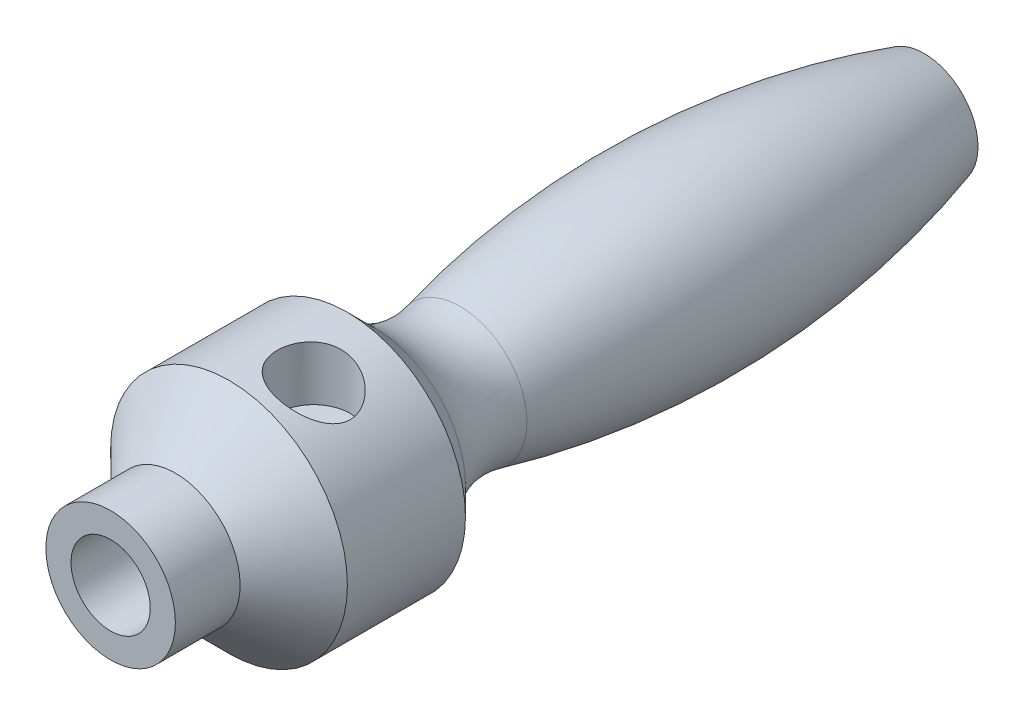
ISO-10303-21;
HEADER;
FILE_DESCRIPTION(('STEP AP214'),'2;1');
FILE_NAME('part.step','',(''),(''),'','','');
FILE_SCHEMA(('AUTOMOTIVE_DESIGN { 1 0 10303 214 1 1 1 1 }'));
ENDSEC;
DATA;
#1=APPLICATION_CONTEXT('core data for automotive mechanical design processes');
#2=APPLICATION_PROTOCOL_DEFINITION('international standard','automotive_design',2000,#1);
#3=PRODUCT_CONTEXT('',#1,'mechanical');
#4=PRODUCT('Part','Part','',(#3));
#5=PRODUCT_RELATED_PRODUCT_CATEGORY('part','',(#4));
#6=PRODUCT_DEFINITION_FORMATION('','',#4);
#7=PRODUCT_DEFINITION_CONTEXT('part definition',#1,'design');
#8=PRODUCT_DEFINITION('design','',#6,#7);
#9=PRODUCT_DEFINITION_SHAPE('','',#8);
#10=(LENGTH_UNIT() NAMED_UNIT(*) SI_UNIT(.MILLI.,.METRE.));
#11=(NAMED_UNIT(*) PLANE_ANGLE_UNIT() SI_UNIT($,.RADIAN.));
#12=(NAMED_UNIT(*) SI_UNIT($,.STERADIAN.) SOLID_ANGLE_UNIT());
#13=UNCERTAINTY_MEASURE_WITH_UNIT(LENGTH_MEASURE(1.E-05),#10,'distance_accuracy_value','');
#14=(GEOMETRIC_REPRESENTATION_CONTEXT(3) GLOBAL_UNCERTAINTY_ASSIGNED_CONTEXT((#13)) GLOBAL_UNIT_ASSIGNED_CONTEXT((#10,
#11,#12)) REPRESENTATION_CONTEXT('',''));
#15=CARTESIAN_POINT('',(0.,0.,0.));
#16=DIRECTION('',(0.,0.,1.));
#17=DIRECTION('',(1.,0.,0.));
#18=AXIS2_PLACEMENT_3D('',#15,#16,#17);
#19=CARTESIAN_POINT('',(0.,0.,0.));
#20=DIRECTION('',(0.,0.,1.));
#21=DIRECTION('',(1.,0.,0.));
#22=AXIS2_PLACEMENT_3D('',#19,#20,#21);
#23=CYLINDRICAL_SURFACE('',#22,13.);
#24=CARTESIAN_POINT('',(0.,0.,-13.));
#25=DIRECTION('',(0.,0.,1.));
#26=DIRECTION('',(1.,0.,0.));
#27=AXIS2_PLACEMENT_3D('',#24,#25,#26);
#28=CIRCLE('',#27,13.);
#29=CARTESIAN_POINT('',(13.,0.,-13.));
#30=VERTEX_POINT('',#29);
#31=EDGE_CURVE('E142',#30,#30,#28,.T.);
#32=ORIENTED_EDGE('',*,*,#31,.F.);
#33=EDGE_LOOP('',(#32));
#34=FACE_BOUND('',#33,.T.);
#35=CARTESIAN_POINT('',(0.,0.,-25.9661538461538));
#36=DIRECTION('',(0.,0.,1.));
#37=DIRECTION('',(1.,0.,0.));
#38=AXIS2_PLACEMENT_3D('',#35,#36,#37);
#39=CIRCLE('',#38,13.);
#40=CARTESIAN_POINT('',(13.,0.,-25.9661538461538));
#41=VERTEX_POINT('',#40);
#42=EDGE_CURVE('E139',#41,#41,#39,.T.);
#43=ORIENTED_EDGE('',*,*,#42,.T.);
#44=EDGE_LOOP('',(#43));
#45=FACE_BOUND('',#44,.T.);
#46=CARTESIAN_POINT('',(3.8,12.432216214336,-22.5));
#47=CARTESIAN_POINT('',(4.03866888973674,12.3592640434929,-22.5000008312517));
#48=CARTESIAN_POINT('',(4.27518952197054,12.2793821450752,-22.4785851030644));
#49=CARTESIAN_POINT('',(4.73696804686455,12.1087505432336,-22.3957917651093));
#50=CARTESIAN_POINT('',(4.96222245494336,12.017997506533,-22.3344018728542));
#51=CARTESIAN_POINT('',(5.39536516527308,11.8298614989242,-22.175305913249));
#52=CARTESIAN_POINT('',(5.60331327784174,11.7325036698764,-22.0777318739504));
#53=CARTESIAN_POINT('',(5.99882847099248,11.5352918197062,-21.8492343794999));
#54=CARTESIAN_POINT('',(6.1863827534139,11.4354362789347,-21.7182901532285));
#55=CARTESIAN_POINT('',(6.54902174922886,11.2319333452747,-21.4158643306936));
#56=CARTESIAN_POINT('',(6.72246196987392,11.1284718003313,-21.2422748446885));
#57=CARTESIAN_POINT('',(7.03698495324367,10.9322992744837,-20.8627436463934));
#58=CARTESIAN_POINT('',(7.17810268279124,10.8395767302274,-20.6568373052602));
#59=CARTESIAN_POINT('',(7.39330377428691,10.6935431512084,-20.267832683763));
#60=CARTESIAN_POINT('',(7.47534684926271,10.6360902422664,-20.0907319377081));
#61=CARTESIAN_POINT('',(7.57905805934738,10.5621812161158,-19.8146879260425));
#62=CARTESIAN_POINT('',(7.61040370697754,10.5395893140938,-19.7209374016599));
#63=CARTESIAN_POINT('',(7.66626148001394,10.4990299553628,-19.5304647431467));
#64=CARTESIAN_POINT('',(7.6907765415114,10.4810605119702,-19.4337439056999));
#65=CARTESIAN_POINT('',(7.73276428217518,10.4501216935964,-19.2372466750263));
#66=CARTESIAN_POINT('',(7.75018483091966,10.4371893604429,-19.1374532611335));
#67=CARTESIAN_POINT('',(7.77742666433512,10.4169057112706,-18.9363139318434));
#68=CARTESIAN_POINT('',(7.78725148563133,10.4095517979297,-18.8349687613983));
#69=CARTESIAN_POINT('',(7.79913294968772,10.4006529159679,-18.6315756109666));
#70=CARTESIAN_POINT('',(7.80119019108627,10.399107499693,-18.5295276857478));
#71=CARTESIAN_POINT('',(7.79749902893922,10.4018755209126,-18.3256594642715));
#72=CARTESIAN_POINT('',(7.79175122382043,10.406188509233,-18.2238391511621));
#73=CARTESIAN_POINT('',(7.77358311988037,10.4197657071794,-18.0321404879848));
#74=CARTESIAN_POINT('',(7.7619395283524,10.428453028454,-17.942146294432));
#75=CARTESIAN_POINT('',(7.7326818383696,10.4501654292255,-17.7636537658123));
#76=CARTESIAN_POINT('',(7.71506575957209,10.4631919474775,-17.675155937138));
#77=CARTESIAN_POINT('',(7.65358779850002,10.5083405740202,-17.412773246216));
#78=CARTESIAN_POINT('',(7.60108317498158,10.5465418331196,-17.24186629351));
#79=CARTESIAN_POINT('',(7.47223549221576,10.6382421721251,-16.9033843198777));
#80=CARTESIAN_POINT('',(7.39482899152693,10.6924123571373,-16.7364062237667));
#81=CARTESIAN_POINT('',(7.21993657266396,10.8112763381226,-16.4174185206025));
#82=CARTESIAN_POINT('',(7.12244145752811,10.8759749513544,-16.2654158168594));
#83=CARTESIAN_POINT('',(6.89086218168677,11.0244316207567,-15.9522680769638));
#84=CARTESIAN_POINT('',(6.75335502947749,11.1095340366995,-15.7942925272974));
#85=CARTESIAN_POINT('',(6.45699542143629,11.2843633695973,-15.5027286128934));
#86=CARTESIAN_POINT('',(6.29812665724968,11.3740937871798,-15.3691590663406));
#87=CARTESIAN_POINT('',(5.93642161641261,11.5674982067501,-15.1099562605133));
#88=CARTESIAN_POINT('',(5.73056783174414,11.6712343226745,-14.9885574395085));
#89=CARTESIAN_POINT('',(5.29829703971847,11.8737044028926,-14.7835185392754));
#90=CARTESIAN_POINT('',(5.07187560512112,11.9724372830676,-14.6998866127135));
#91=CARTESIAN_POINT('',(4.71963841447271,12.113687969068,-14.6052153672505));
#92=CARTESIAN_POINT('',(4.59928052752428,12.1599145044003,-14.5787165603922));
#93=CARTESIAN_POINT('',(4.35555398261508,12.249324298558,-14.5368415780157));
#94=CARTESIAN_POINT('',(4.23218668818855,12.2925089023981,-14.5214604585042));
#95=CARTESIAN_POINT('',(3.98343347089435,12.3753565382,-14.5022614734818));
#96=CARTESIAN_POINT('',(3.85804825040597,12.4150207654677,-14.4984396684384));
#97=CARTESIAN_POINT('',(3.60631432012454,12.49046640941,-14.5027102586209));
#98=CARTESIAN_POINT('',(3.47996571961999,12.5262482596996,-14.5108013218487));
#99=CARTESIAN_POINT('',(3.23885317960885,12.5906306898785,-14.5378686612623));
#100=CARTESIAN_POINT('',(3.12406665000116,12.6195875217306,-14.5558034972374));
#101=CARTESIAN_POINT('',(2.89569346143271,12.6739390849278,-14.6018217415477));
#102=CARTESIAN_POINT('',(2.78210669431827,12.6993341399308,-14.6299042269376));
#103=CARTESIAN_POINT('',(2.55719333927117,12.7465275115943,-14.6961635559671));
#104=CARTESIAN_POINT('',(2.44586600535568,12.7683270328855,-14.7343370075748));
#105=CARTESIAN_POINT('',(2.22647270072708,12.8084055773594,-14.8206109880181));
#106=CARTESIAN_POINT('',(2.11840657790586,12.8266847649508,-14.8687110530378));
#107=CARTESIAN_POINT('',(1.91440232498268,12.8586517982827,-14.9706169112978));
#108=CARTESIAN_POINT('',(1.81815846273046,12.872579291469,-15.0237371868162));
#109=CARTESIAN_POINT('',(1.63008771088667,12.8977446942279,-15.1379194344255));
#110=CARTESIAN_POINT('',(1.53826226838369,12.9089817273673,-15.19898398444));
#111=CARTESIAN_POINT('',(1.35983691534852,12.9289946090808,-15.3286031180182));
#112=CARTESIAN_POINT('',(1.27323478763305,12.9377715077815,-15.3971544883593));
#113=CARTESIAN_POINT('',(1.10585930243799,12.9531518305977,-15.5413158793725));
#114=CARTESIAN_POINT('',(1.02508813184976,12.959754442523,-15.6169285242294));
#115=CARTESIAN_POINT('',(0.870861179696782,12.9710260482357,-15.773810624714));
#116=CARTESIAN_POINT('',(0.797335777290691,12.9757151664774,-15.855010120484));
#117=CARTESIAN_POINT('',(0.65714561854057,12.9835699521421,-16.0232127367165));
#118=CARTESIAN_POINT('',(0.590483355684938,12.9867350673952,-16.1102179476993));
#119=CARTESIAN_POINT('',(0.401583105720889,12.9944081250472,-16.3790081684645));
#120=CARTESIAN_POINT('',(0.290280862639021,12.9971034566512,-16.5687213626638));
#121=CARTESIAN_POINT('',(0.098640586649652,12.9999876317857,-16.9671246762101));
#122=CARTESIAN_POINT('',(0.0188679428599122,13.0001325755197,-17.1760850299163));
#123=CARTESIAN_POINT('',(-0.10481144427014,12.9997253813955,-17.6043941904658));
#124=CARTESIAN_POINT('',(-0.14871677862761,12.9991732161548,-17.8237434050588));
#125=CARTESIAN_POINT('',(-0.199624314887042,12.9984931963582,-18.268579573878));
#126=CARTESIAN_POINT('',(-0.206308869678826,12.9983689975331,-18.4941029018869));
#127=CARTESIAN_POINT('',(-0.181736810220484,12.998735084221,-18.9430769418921));
#128=CARTESIAN_POINT('',(-0.150479308090461,12.9992253841137,-19.1665276052627));
#129=CARTESIAN_POINT('',(-0.0508902433648136,12.999994802002,-19.6050911822196));
#130=CARTESIAN_POINT('',(0.0174541758231861,13.0002738466833,-19.8202011766966));
#131=CARTESIAN_POINT('',(0.18928912592395,12.9989041644428,-20.2359001622078));
#132=CARTESIAN_POINT('',(0.292780638485772,12.9972553836743,-20.4364887474729));
#133=CARTESIAN_POINT('',(0.531803205629528,12.9896655886868,-20.8171844872617));
#134=CARTESIAN_POINT('',(0.667298429711154,12.9837293593956,-20.9973142153891));
#135=CARTESIAN_POINT('',(0.966353497765473,12.9648964513341,-21.3321032651323));
#136=CARTESIAN_POINT('',(1.12990923494068,12.9520007905199,-21.4867663074435));
#137=CARTESIAN_POINT('',(1.47778305563094,12.9168984429496,-21.764383334371));
#138=CARTESIAN_POINT('',(1.66181474484716,12.8948106663993,-21.8877109821617));
#139=CARTESIAN_POINT('',(2.04636003378755,12.8393969151784,-22.1018309518189));
#140=CARTESIAN_POINT('',(2.2468733611252,12.8060711262064,-22.1926238112442));
#141=CARTESIAN_POINT('',(2.6709027267283,12.7246092532685,-22.3443425409857));
#142=CARTESIAN_POINT('',(2.89507167378101,12.6756704321089,-22.403018802019));
#143=CARTESIAN_POINT('',(3.34679944205318,12.5639619946616,-22.4808562609491));
#144=CARTESIAN_POINT('',(3.57435977963556,12.5011860072708,-22.4999992141254));
#145=CARTESIAN_POINT('',(3.8,12.432216214336,-22.5));
#146=B_SPLINE_CURVE_WITH_KNOTS('',3,(#46,#47,#48,#49,#50,#51,#52,#53,#54,#55,#56,#57,#58,#59,
#60,#61,#62,#63,#64,#65,#66,#67,#68,#69,#70,#71,#72,#73,#74,#75,#76,#77,#78,#79,#80,#81,#82,#83,
#84,#85,#86,#87,#88,#89,#90,#91,#92,#93,#94,#95,#96,#97,#98,#99,#100,#101,#102,#103,#104,#105,
#106,#107,#108,#109,#110,#111,#112,#113,#114,#115,#116,#117,#118,#119,#120,#121,#122,#123,#124,
#125,#126,#127,#128,#129,#130,#131,#132,#133,#134,#135,#136,#137,#138,#139,#140,#141,#142,#143,
#144,#145),.UNSPECIFIED.,.T.,.F.,(4,2,2,2,2,2,2,2,2,2,2,2,2,2,2,2,2,2,2,2,2,2,2,2,2,2,2,2,2,2,2,
2,2,2,2,2,2,2,2,2,2,2,2,2,2,2,2,2,2,4),(0.,0.747763835208472,1.49575753729901,2.24104840562656,
2.9868043147551,3.7818705015663,4.57607247137836,5.18378468039269,5.48766354302585,
5.79141158271915,6.09735294980327,6.40315178245782,6.70892704706973,7.01467886867109,
7.28783352245077,7.56107883690454,8.10717254486274,8.6806526817086,9.25439595471119,
9.93001980920547,10.6061624234673,11.3842699965005,12.1625454579079,12.5569727532558,
12.951224540188,13.3453419469332,13.7394152900842,14.0981423247377,14.4568367407922,
14.8154107363504,15.1739679815132,15.5059948458296,15.8381297231441,16.1701226095695,
16.5022393694056,16.8307671343485,17.1594138405717,17.8160687759269,18.4840158556322,
19.1519891731775,19.8256544273383,20.4993354462051,21.173250153423,21.8471836844492,
22.520366244306,23.1934503644186,23.8580854812259,24.5227096160383,25.2293278214775,
25.9362720601804),.UNSPECIFIED.);
#147=CARTESIAN_POINT('',(3.8,12.432216214336,-22.5));
#148=VERTEX_POINT('',#147);
#149=EDGE_CURVE('E38',#148,#148,#146,.T.);
#150=ORIENTED_EDGE('',*,*,#149,.T.);
#151=EDGE_LOOP('',(#150));
#152=FACE_BOUND('',#151,.T.);
#153=ADVANCED_FACE('F33',(#34,#45,#152),#23,.T.);
#154=CARTESIAN_POINT('',(3.8,-5.,-18.5));
#155=DIRECTION('',(0.,1.,0.));
#156=DIRECTION('',(0.,0.,1.));
#157=AXIS2_PLACEMENT_3D('',#154,#155,#156);
#158=CYLINDRICAL_SURFACE('',#157,1.5);
#159=CARTESIAN_POINT('',(3.8,-5.,-18.5));
#160=DIRECTION('',(0.,1.,0.));
#161=DIRECTION('',(0.,0.,1.));
#162=AXIS2_PLACEMENT_3D('',#159,#160,#161);
#163=CIRCLE('',#162,1.5);
#164=CARTESIAN_POINT('',(3.8,-5.,-17.));
#165=VERTEX_POINT('',#164);
#166=EDGE_CURVE('E60',#165,#165,#163,.T.);
#167=ORIENTED_EDGE('',*,*,#166,.F.);
#168=EDGE_LOOP('',(#167));
#169=FACE_BOUND('',#168,.T.);
#170=CARTESIAN_POINT('',(4.35,0.,-19.8955285736953));
#171=CARTESIAN_POINT('',(4.34999973253327,-0.115602395936597,-19.8955296980727));
#172=CARTESIAN_POINT('',(4.3453873950031,-0.2312090392118,-19.8973732661898));
#173=CARTESIAN_POINT('',(4.32698413936694,-0.461591055147139,-19.9044153235058));
#174=CARTESIAN_POINT('',(4.3131921294526,-0.576366327284283,-19.9096142117762));
#175=CARTESIAN_POINT('',(4.27648218663029,-0.804754721607832,-19.9224424154697));
#176=CARTESIAN_POINT('',(4.25352949667548,-0.918361707531673,-19.930080965042));
#177=CARTESIAN_POINT('',(4.19866022913715,-1.14330966269523,-19.946335672407));
#178=CARTESIAN_POINT('',(4.16674382712765,-1.25465067627319,-19.9549518110495));
#179=CARTESIAN_POINT('',(4.09288819660683,-1.4782038822241,-19.9716310406221));
#180=CARTESIAN_POINT('',(4.05064726500249,-1.59031883186863,-19.979665682508));
#181=CARTESIAN_POINT('',(3.95695324199912,-1.81090655310153,-19.992515642876));
#182=CARTESIAN_POINT('',(3.90549608311082,-1.91937769132629,-19.9973295354524));
#183=CARTESIAN_POINT('',(3.79401667896578,-2.13124000149958,-20.0010195569177));
#184=CARTESIAN_POINT('',(3.7340417822911,-2.23465526913691,-19.9999273489804));
#185=CARTESIAN_POINT('',(3.6060556449965,-2.43578045539861,-19.9887932238877));
#186=CARTESIAN_POINT('',(3.53805629545628,-2.53349850324665,-19.9787644085345));
#187=CARTESIAN_POINT('',(3.40165163401747,-2.71345903232513,-19.947676548973));
#188=CARTESIAN_POINT('',(3.33381507428981,-2.7963057143697,-19.9276724716946));
#189=CARTESIAN_POINT('',(3.19451132066189,-2.95442941658624,-19.8743831496933));
#190=CARTESIAN_POINT('',(3.1230469874953,-3.0297122659308,-19.8411082321533));
#191=CARTESIAN_POINT('',(2.99033748263496,-3.16033964687315,-19.7646783435335));
#192=CARTESIAN_POINT('',(2.92913741238037,-3.21698769986797,-19.7237003193369));
#193=CARTESIAN_POINT('',(2.80948237786733,-3.3219910383414,-19.6290138065664));
#194=CARTESIAN_POINT('',(2.75102454117531,-3.37035514859924,-19.575319012191));
#195=CARTESIAN_POINT('',(2.6488769793886,-3.45102072938017,-19.464219668866));
#196=CARTESIAN_POINT('',(2.60429076584765,-3.48464520755532,-19.4086037101785));
#197=CARTESIAN_POINT('',(2.52212139374479,-3.54457227278741,-19.2888541539648));
#198=CARTESIAN_POINT('',(2.48453672951206,-3.57087643466779,-19.2247223928396));
#199=CARTESIAN_POINT('',(2.41847548636282,-3.61594979940475,-19.0891485909684));
#200=CARTESIAN_POINT('',(2.39003272188596,-3.63469109222847,-19.0176806716335));
#201=CARTESIAN_POINT('',(2.34422302265472,-3.66440628641626,-18.8697368531602));
#202=CARTESIAN_POINT('',(2.32685474633411,-3.67538112862778,-18.7932615618544));
#203=CARTESIAN_POINT('',(2.30507397495752,-3.68907658629589,-18.6432957509376));
#204=CARTESIAN_POINT('',(2.29983955306296,-3.69232130177534,-18.569971119213));
#205=CARTESIAN_POINT('',(2.30016784590081,-3.69211719662813,-18.4233658956445));
#206=CARTESIAN_POINT('',(2.30572792802919,-3.68867000804809,-18.3500852974215));
#207=CARTESIAN_POINT('',(2.32709547759172,-3.67522485712081,-18.2073476418621));
#208=CARTESIAN_POINT('',(2.34267194562136,-3.66537451097042,-18.137841776258));
#209=CARTESIAN_POINT('',(2.38303311249966,-3.63926180583502,-18.0028395476461));
#210=CARTESIAN_POINT('',(2.40781737604219,-3.62299974996665,-17.9373429952651));
#211=CARTESIAN_POINT('',(2.46582567881114,-3.58377508313715,-17.8108665623104));
#212=CARTESIAN_POINT('',(2.49919138853675,-3.56069892567822,-17.7499871924614));
#213=CARTESIAN_POINT('',(2.57241221315142,-3.50816498045908,-17.6353265668377));
#214=CARTESIAN_POINT('',(2.61226839391201,-3.47870614426606,-17.581546479545));
#215=CARTESIAN_POINT('',(2.69942960498699,-3.4115678562927,-17.4784293975414));
#216=CARTESIAN_POINT('',(2.74705657238663,-3.37346622111783,-17.429641538824));
#217=CARTESIAN_POINT('',(2.84526708942468,-3.29106047465249,-17.3411801972641));
#218=CARTESIAN_POINT('',(2.89585216949143,-3.24675313590316,-17.3015114856405));
#219=CARTESIAN_POINT('',(3.02119226277005,-3.13129826185969,-17.2148514049952));
#220=CARTESIAN_POINT('',(3.09649430364601,-3.05709756116088,-17.1727115464906));
#221=CARTESIAN_POINT('',(3.24458648966007,-2.89946979088688,-17.1042161865942));
#222=CARTESIAN_POINT('',(3.31737114872171,-2.81602405509842,-17.0778933346733));
#223=CARTESIAN_POINT('',(3.43924624738513,-2.66475626828264,-17.0430321522665));
#224=CARTESIAN_POINT('',(3.48956640293043,-2.59853363294379,-17.0316462469309));
#225=CARTESIAN_POINT('',(3.58664272822755,-2.46281641820689,-17.0144337938068));
#226=CARTESIAN_POINT('',(3.63339713781413,-2.39332024992052,-17.0086099755048));
#227=CARTESIAN_POINT('',(3.76781041919762,-2.18042480927038,-16.9976394214771));
#228=CARTESIAN_POINT('',(3.84944444891801,-2.03283513248657,-16.9990345064804));
#229=CARTESIAN_POINT('',(3.97452255530719,-1.77212052751653,-17.0092658870445));
#230=CARTESIAN_POINT('',(4.02226560025524,-1.66087855533629,-17.0159157588225));
#231=CARTESIAN_POINT('',(4.10831459720201,-1.43487105280404,-17.0313762201511));
#232=CARTESIAN_POINT('',(4.14661669111295,-1.32010410342822,-17.0401876901235));
#233=CARTESIAN_POINT('',(4.21349750902822,-1.08790141144305,-17.057705075166));
#234=CARTESIAN_POINT('',(4.24208618462418,-0.970468532566169,-17.0664110894024));
#235=CARTESIAN_POINT('',(4.28940998066098,-0.733518904124057,-17.0818675193163));
#236=CARTESIAN_POINT('',(4.30814701195875,-0.614002563323695,-17.0886183141204));
#237=CARTESIAN_POINT('',(4.33568406171878,-0.373005441684108,-17.0988353791066));
#238=CARTESIAN_POINT('',(4.34442815720466,-0.251517427364384,-17.1022831475275));
#239=CARTESIAN_POINT('',(4.35169487481931,-0.00818280725648475,-17.1051348395859));
#240=CARTESIAN_POINT('',(4.35021729983478,0.11366380540156,-17.1045386852411));
#241=CARTESIAN_POINT('',(4.33704886612537,0.356874813593258,-17.0994190617767));
#242=CARTESIAN_POINT('',(4.32534462083432,0.47823836755992,-17.094890445168));
#243=CARTESIAN_POINT('',(4.29182785915549,0.719400330138607,-17.0828125906941));
#244=CARTESIAN_POINT('',(4.27001525372731,0.83919872495423,-17.0752633262214));
#245=CARTESIAN_POINT('',(4.21770830323968,1.07092705113418,-17.059086851995));
#246=CARTESIAN_POINT('',(4.18766447544425,1.18296393817008,-17.0505260322723));
#247=CARTESIAN_POINT('',(4.11871194534289,1.40433402623409,-17.0338209785872));
#248=CARTESIAN_POINT('',(4.07980160824524,1.51366672454238,-17.025676821788));
#249=CARTESIAN_POINT('',(3.99338342372232,1.72881434731254,-17.0118755532813));
#250=CARTESIAN_POINT('',(3.94589235157581,1.8346356669683,-17.0062136614857));
#251=CARTESIAN_POINT('',(3.84256235087069,2.04221529217329,-16.999711384241));
#252=CARTESIAN_POINT('',(3.78672928842605,2.14397638967468,-16.9988676268872));
#253=CARTESIAN_POINT('',(3.65926183206074,2.35573992728382,-17.0050773080301));
#254=CARTESIAN_POINT('',(3.58651441454167,2.46505567406189,-17.0131885165663));
#255=CARTESIAN_POINT('',(3.43243935021561,2.67540036166478,-17.0436184367523));
#256=CARTESIAN_POINT('',(3.35112324826306,2.7764401346435,-17.0659182308313));
#257=CARTESIAN_POINT('',(3.20048865203473,2.94781144982127,-17.1231691360817));
#258=CARTESIAN_POINT('',(3.13215855161357,3.02017649587799,-17.1545584593384));
#259=CARTESIAN_POINT('',(2.9950074625085,3.15621701236934,-17.2318692502022));
#260=CARTESIAN_POINT('',(2.92618730099423,3.21990458093369,-17.2777701828326));
#261=CARTESIAN_POINT('',(2.80529455232616,3.32535324943411,-17.3751207489264));
#262=CARTESIAN_POINT('',(2.75257258004493,3.36896843359624,-17.4237441526645));
#263=CARTESIAN_POINT('',(2.6522230176167,3.44852264145522,-17.5314874881654));
#264=CARTESIAN_POINT('',(2.60459389031605,3.48446398460099,-17.5906042383509));
#265=CARTESIAN_POINT('',(2.51707801807168,3.54820813449867,-17.7188662501054));
#266=CARTESIAN_POINT('',(2.47723753819808,3.57596277930876,-17.7880674145681));
#267=CARTESIAN_POINT('',(2.4083761082895,3.622702325212,-17.934393259363));
#268=CARTESIAN_POINT('',(2.37935176803354,3.64168997468715,-18.0115154472376));
#269=CARTESIAN_POINT('',(2.33650157624273,3.66931095421255,-18.1627916949513));
#270=CARTESIAN_POINT('',(2.32141939007796,3.67880850726458,-18.2364349489209));
#271=CARTESIAN_POINT('',(2.30247212675231,3.69069807363692,-18.3857048910708));
#272=CARTESIAN_POINT('',(2.29860326091307,3.69309248692292,-18.461330900615));
#273=CARTESIAN_POINT('',(2.30221201781222,3.69084272281158,-18.6086888034053));
#274=CARTESIAN_POINT('',(2.30917336941603,3.68651881685309,-18.6804390951449));
#275=CARTESIAN_POINT('',(2.33312081385334,3.6714092020467,-18.8215333165794));
#276=CARTESIAN_POINT('',(2.35010556905815,3.66062435541196,-18.8908775660548));
#277=CARTESIAN_POINT('',(2.3932308959999,3.63257515965772,-19.0253502749094));
#278=CARTESIAN_POINT('',(2.41938179055305,3.61530350358217,-19.0904738826525));
#279=CARTESIAN_POINT('',(2.47947232218554,3.57435771229535,-19.2148271923305));
#280=CARTESIAN_POINT('',(2.51341254976994,3.55068309165457,-19.2740564469294));
#281=CARTESIAN_POINT('',(2.58899018297986,3.49598204486394,-19.387875050237));
#282=CARTESIAN_POINT('',(2.63089711156583,3.46468181841812,-19.4421527108516));
#283=CARTESIAN_POINT('',(2.71925118918352,3.39577830961218,-19.5423289189783));
#284=CARTESIAN_POINT('',(2.76569978149229,3.35817302086042,-19.5882247895004));
#285=CARTESIAN_POINT('',(2.86635527226525,3.2728149302077,-19.67611647563));
#286=CARTESIAN_POINT('',(2.92085398369412,3.22440125355735,-19.7171303824461));
#287=CARTESIAN_POINT('',(3.03058949033248,3.12148880085807,-19.7893135909221));
#288=CARTESIAN_POINT('',(3.08582668558385,3.06698659842178,-19.8204773111186));
#289=CARTESIAN_POINT('',(3.18453586009523,2.96399889319259,-19.8687984040693));
#290=CARTESIAN_POINT('',(3.2282046583572,2.91640790722662,-19.887501442497));
#291=CARTESIAN_POINT('',(3.31416559253742,2.818345052589,-19.9198851204824));
#292=CARTESIAN_POINT('',(3.35645703237267,2.76787176168876,-19.9335632554004));
#293=CARTESIAN_POINT('',(3.48062500942585,2.61252383067096,-19.9681303592972));
#294=CARTESIAN_POINT('',(3.55965037064913,2.50387101580599,-19.9824872397929));
#295=CARTESIAN_POINT('',(3.69049350785732,2.305112965186,-19.9970924415549));
#296=CARTESIAN_POINT('',(3.74438954796169,2.21648621448309,-19.9998254628112));
#297=CARTESIAN_POINT('',(3.8457474665315,2.03555095429489,-20.0001583243516));
#298=CARTESIAN_POINT('',(3.89320566468155,1.943240377575,-19.9977552415255));
#299=CARTESIAN_POINT('',(3.98140453595888,1.75547754035982,-19.9896498603311));
#300=CARTESIAN_POINT('',(4.02213583367462,1.66002111387887,-19.9839430064836));
#301=CARTESIAN_POINT('',(4.09664569420924,1.46654033640282,-19.970860832568));
#302=CARTESIAN_POINT('',(4.13042358027025,1.36851573649957,-19.9634853502431));
#303=CARTESIAN_POINT('',(4.19197779446776,1.16676515317154,-19.9482388094801));
#304=CARTESIAN_POINT('',(4.21949533906683,1.06296079259189,-19.9403594646299));
#305=CARTESIAN_POINT('',(4.26679365880315,0.853520108597894,-19.9257340113576));
#306=CARTESIAN_POINT('',(4.28657433281006,0.747883761256092,-19.9189879177492));
#307=CARTESIAN_POINT('',(4.31823955016818,0.535540603531698,-19.9077326299508));
#308=CARTESIAN_POINT('',(4.3301408932892,0.428836566277306,-19.9032186817716));
#309=CARTESIAN_POINT('',(4.34602117918348,0.214756233716812,-19.8971161547945));
#310=CARTESIAN_POINT('',(4.35000024844263,0.107379949171171,-19.8955275292915));
#311=CARTESIAN_POINT('',(4.35,0.,-19.8955285736953));
#312=B_SPLINE_CURVE_WITH_KNOTS('',3,(#170,#171,#172,#173,#174,#175,#176,#177,#178,#179,#180,
#181,#182,#183,#184,#185,#186,#187,#188,#189,#190,#191,#192,#193,#194,#195,#196,#197,#198,#199,
#200,#201,#202,#203,#204,#205,#206,#207,#208,#209,#210,#211,#212,#213,#214,#215,#216,#217,#218,
#219,#220,#221,#222,#223,#224,#225,#226,#227,#228,#229,#230,#231,#232,#233,#234,#235,#236,#237,
#238,#239,#240,#241,#242,#243,#244,#245,#246,#247,#248,#249,#250,#251,#252,#253,#254,#255,#256,
#257,#258,#259,#260,#261,#262,#263,#264,#265,#266,#267,#268,#269,#270,#271,#272,#273,#274,#275,
#276,#277,#278,#279,#280,#281,#282,#283,#284,#285,#286,#287,#288,#289,#290,#291,#292,#293,#294,
#295,#296,#297,#298,#299,#300,#301,#302,#303,#304,#305,#306,#307,#308,#309,#310,#311),
.UNSPECIFIED.,.T.,.F.,(4,2,2,2,2,2,2,2,2,2,2,2,2,2,2,2,2,2,2,2,2,2,2,2,2,2,2,2,2,2,2,2,2,2,2,2,
2,2,2,2,2,2,2,2,2,2,2,2,2,2,2,2,2,2,2,2,2,2,2,2,2,2,2,2,2,2,2,2,2,2,4),(0.,0.34671004156538,
0.693461327367132,1.04154094258089,1.38961374036535,1.74942459477451,2.10939464115641,
2.46743677319986,2.82495484805234,3.15082577534781,3.47644360769197,3.75410389799285,
4.03146653539211,4.26689006418192,4.5022629069658,4.73849659672411,4.97470166363527,
5.19436953206803,5.41398383380884,5.62870664298477,5.84341930225384,6.06193382735454,
6.28048427337973,6.51386502269342,6.74736760237858,7.08687743048134,7.42708568868505,
7.67858746138931,7.93021259040092,8.43429697365889,8.79763564758379,9.16112255626331,
9.52423593440389,9.88727885588775,10.2523436580859,10.6174155001636,10.982965933215,
11.3485195863112,11.6970868706908,12.0457184753829,12.3936757406581,12.7413894629809,
13.1350287409069,13.5281442781979,13.8401106349463,14.1516374979122,14.4024319001364,
14.6531503911087,14.90531570351,15.1574019103659,15.3835557758153,15.6096332210634,
15.8252592797068,16.0408565694396,16.2566974470166,16.4725546927797,16.6977526309136,
16.9230223678334,17.1730325278258,17.4231840994864,17.6246329063548,17.8261819886432,
18.2299269249149,18.5408530016074,18.8519560827395,19.1634891605869,19.4750525448361,
19.7977934496472,20.1205385729347,20.4425933258413,20.7646429368273),.UNSPECIFIED.);
#313=CARTESIAN_POINT('',(4.35,0.,-19.8955285736953));
#314=VERTEX_POINT('',#313);
#315=EDGE_CURVE('E68',#314,#314,#312,.T.);
#316=ORIENTED_EDGE('',*,*,#315,.T.);
#317=EDGE_LOOP('',(#316));
#318=FACE_BOUND('',#317,.T.);
#319=CARTESIAN_POINT('',(3.8,7.,-18.5));
#320=DIRECTION('',(0.,1.,0.));
#321=DIRECTION('',(0.,0.,1.));
#322=AXIS2_PLACEMENT_3D('',#319,#320,#321);
#323=CIRCLE('',#322,1.5);
#324=CARTESIAN_POINT('',(3.8,7.,-17.));
#325=VERTEX_POINT('',#324);
#326=EDGE_CURVE('E54',#325,#325,#323,.F.);
#327=ORIENTED_EDGE('',*,*,#326,.F.);
#328=EDGE_LOOP('',(#327));
#329=FACE_BOUND('',#328,.T.);
#330=ADVANCED_FACE('F76',(#169,#318,#329),#158,.F.);
#331=CARTESIAN_POINT('',(0.,0.,0.));
#332=DIRECTION('',(0.,0.,1.));
#333=DIRECTION('',(1.,0.,0.));
#334=AXIS2_PLACEMENT_3D('',#331,#332,#333);
#335=CYLINDRICAL_SURFACE('',#334,4.35);
#336=ORIENTED_EDGE('',*,*,#315,.F.);
#337=EDGE_LOOP('',(#336));
#338=FACE_BOUND('',#337,.T.);
#339=CARTESIAN_POINT('',(0.,0.,0.));
#340=DIRECTION('',(0.,0.,1.));
#341=DIRECTION('',(1.,0.,0.));
#342=AXIS2_PLACEMENT_3D('',#339,#340,#341);
#343=CIRCLE('',#342,4.35);
#344=CARTESIAN_POINT('',(4.35,0.,0.));
#345=VERTEX_POINT('',#344);
#346=EDGE_CURVE('E10',#345,#345,#343,.T.);
#347=ORIENTED_EDGE('',*,*,#346,.T.);
#348=EDGE_LOOP('',(#347));
#349=FACE_BOUND('',#348,.T.);
#350=CARTESIAN_POINT('',(0.,0.,-24.5));
#351=DIRECTION('',(0.,0.,1.));
#352=DIRECTION('',(1.,0.,0.));
#353=AXIS2_PLACEMENT_3D('',#350,#351,#352);
#354=CIRCLE('',#353,4.35);
#355=CARTESIAN_POINT('',(4.35,0.,-24.5));
#356=VERTEX_POINT('',#355);
#357=EDGE_CURVE('E74',#356,#356,#354,.T.);
#358=ORIENTED_EDGE('',*,*,#357,.F.);
#359=EDGE_LOOP('',(#358));
#360=FACE_BOUND('',#359,.T.);
#361=ADVANCED_FACE('F35',(#338,#349,#360),#335,.F.);
#362=CARTESIAN_POINT('',(4.35,0.,0.));
#363=DIRECTION('',(0.,0.,1.));
#364=DIRECTION('',(1.,0.,0.));
#365=AXIS2_PLACEMENT_3D('',#362,#363,#364);
#366=PLANE('',#365);
#367=CARTESIAN_POINT('',(0.,0.,0.));
#368=DIRECTION('',(0.,0.,1.));
#369=DIRECTION('',(1.,0.,0.));
#370=AXIS2_PLACEMENT_3D('',#367,#368,#369);
#371=CIRCLE('',#370,7.11076923076923);
#372=CARTESIAN_POINT('',(7.11076923076923,0.,0.));
#373=VERTEX_POINT('',#372);
#374=EDGE_CURVE('E46',#373,#373,#371,.T.);
#375=ORIENTED_EDGE('',*,*,#374,.T.);
#376=EDGE_LOOP('',(#375));
#377=FACE_BOUND('',#376,.T.);
#378=ORIENTED_EDGE('',*,*,#346,.F.);
#379=EDGE_LOOP('',(#378));
#380=FACE_BOUND('',#379,.T.);
#381=ADVANCED_FACE('F112',(#377,#380),#366,.T.);
#382=CARTESIAN_POINT('',(0.,0.,0.));
#383=DIRECTION('',(0.,0.,1.));
#384=DIRECTION('',(1.,0.,0.));
#385=AXIS2_PLACEMENT_3D('',#382,#383,#384);
#386=CYLINDRICAL_SURFACE('',#385,7.11076923076923);
#387=CARTESIAN_POINT('',(0.,0.,-7.11076923076923));
#388=DIRECTION('',(0.,0.,1.));
#389=DIRECTION('',(1.,0.,0.));
#390=AXIS2_PLACEMENT_3D('',#387,#388,#389);
#391=CIRCLE('',#390,7.11076923076923);
#392=CARTESIAN_POINT('',(7.11076923076923,0.,-7.11076923076923));
#393=VERTEX_POINT('',#392);
#394=EDGE_CURVE('E51',#393,#393,#391,.T.);
#395=ORIENTED_EDGE('',*,*,#394,.T.);
#396=EDGE_LOOP('',(#395));
#397=FACE_BOUND('',#396,.T.);
#398=ORIENTED_EDGE('',*,*,#374,.F.);
#399=EDGE_LOOP('',(#398));
#400=FACE_BOUND('',#399,.T.);
#401=ADVANCED_FACE('F109',(#397,#400),#386,.T.);
#402=CARTESIAN_POINT('',(0.,0.,-7.11076923076923));
#403=DIRECTION('',(0.,0.,-1.));
#404=DIRECTION('',(-1.,0.,0.));
#405=AXIS2_PLACEMENT_3D('',#402,#403,#404);
#406=CONICAL_SURFACE('',#405,7.11076923076923,0.785398163397448);
#407=ORIENTED_EDGE('',*,*,#31,.T.);
#408=EDGE_LOOP('',(#407));
#409=FACE_BOUND('',#408,.T.);
#410=ORIENTED_EDGE('',*,*,#394,.F.);
#411=EDGE_LOOP('',(#410));
#412=FACE_BOUND('',#411,.T.);
#413=ADVANCED_FACE('F101',(#409,#412),#406,.T.);
#414=CARTESIAN_POINT('',(0.,0.,-25.9661538461538));
#415=DIRECTION('',(0.,0.,1.));
#416=DIRECTION('',(1.,0.,0.));
#417=AXIS2_PLACEMENT_3D('',#414,#415,#416);
#418=CONICAL_SURFACE('',#417,13.,0.785398163397448);
#419=CARTESIAN_POINT('',(0.,0.,-28.9739994192771));
#420=DIRECTION('',(0.,0.,1.));
#421=DIRECTION('',(1.,0.,0.));
#422=AXIS2_PLACEMENT_3D('',#419,#420,#421);
#423=CIRCLE('',#422,9.99215442687672);
#424=CARTESIAN_POINT('',(9.99215442687672,0.,-28.9739994192771));
#425=VERTEX_POINT('',#424);
#426=EDGE_CURVE('E134',#425,#425,#423,.T.);
#427=ORIENTED_EDGE('',*,*,#426,.T.);
#428=EDGE_LOOP('',(#427));
#429=FACE_BOUND('',#428,.T.);
#430=ORIENTED_EDGE('',*,*,#42,.F.);
#431=EDGE_LOOP('',(#430));
#432=FACE_BOUND('',#431,.T.);
#433=ADVANCED_FACE('F98',(#429,#432),#418,.T.);
#434=CARTESIAN_POINT('',(0.,0.,-36.0450672311426));
#435=DIRECTION('',(0.,0.,1.));
#436=DIRECTION('',(1.,0.,0.));
#437=AXIS2_PLACEMENT_3D('',#434,#435,#436);
#438=TOROIDAL_SURFACE('',#437,17.0632222387422,9.99999999999998);
#439=CARTESIAN_POINT('',(0.,0.,-38.3748050678915));
#440=DIRECTION('',(0.,0.,1.));
#441=DIRECTION('',(1.,0.,0.));
#442=AXIS2_PLACEMENT_3D('',#439,#440,#441);
#443=CIRCLE('',#442,7.33839208022425);
#444=CARTESIAN_POINT('',(7.33839208022425,0.,-38.3748050678915));
#445=VERTEX_POINT('',#444);
#446=EDGE_CURVE('E131',#445,#445,#443,.T.);
#447=ORIENTED_EDGE('',*,*,#446,.T.);
#448=EDGE_LOOP('',(#447));
#449=FACE_BOUND('',#448,.T.);
#450=ORIENTED_EDGE('',*,*,#426,.F.);
#451=EDGE_LOOP('',(#450));
#452=FACE_BOUND('',#451,.T.);
#453=ADVANCED_FACE('F94',(#449,#452),#438,.F.);
#454=CARTESIAN_POINT('',(0.,0.,-61.2013429716794));
#455=DIRECTION('',(0.,0.,1.));
#456=DIRECTION('',(1.,0.,0.));
#457=AXIS2_PLACEMENT_3D('',#454,#455,#456);
#458=DEGENERATE_TOROIDAL_SURFACE('',#457,87.9445194644853,97.9789980817828,.F.);
#459=CARTESIAN_POINT('',(0.,0.,-89.3426859433588));
#460=DIRECTION('',(0.,0.,1.));
#461=DIRECTION('',(1.,0.,0.));
#462=AXIS2_PLACEMENT_3D('',#459,#460,#461);
#463=CIRCLE('',#462,5.90615384615387);
#464=CARTESIAN_POINT('',(5.90615384615387,0.,-89.3426859433588));
#465=VERTEX_POINT('',#464);
#466=EDGE_CURVE('E129',#465,#465,#463,.T.);
#467=ORIENTED_EDGE('',*,*,#466,.T.);
#468=EDGE_LOOP('',(#467));
#469=FACE_BOUND('',#468,.T.);
#470=ORIENTED_EDGE('',*,*,#446,.F.);
#471=EDGE_LOOP('',(#470));
#472=FACE_BOUND('',#471,.T.);
#473=ADVANCED_FACE('F90',(#469,#472),#458,.F.);
#474=CARTESIAN_POINT('',(5.90615384615386,0.,-89.3426859433588));
#475=DIRECTION('',(0.,0.,-1.));
#476=DIRECTION('',(-1.,0.,0.));
#477=AXIS2_PLACEMENT_3D('',#474,#475,#476);
#478=PLANE('',#477);
#479=ORIENTED_EDGE('',*,*,#466,.F.);
#480=EDGE_LOOP('',(#479));
#481=FACE_BOUND('',#480,.T.);
#482=ADVANCED_FACE('F86',(#481),#478,.T.);
#483=CARTESIAN_POINT('',(4.35,0.,-24.5));
#484=DIRECTION('',(0.,0.,1.));
#485=DIRECTION('',(1.,0.,0.));
#486=AXIS2_PLACEMENT_3D('',#483,#484,#485);
#487=PLANE('',#486);
#488=ORIENTED_EDGE('',*,*,#357,.T.);
#489=EDGE_LOOP('',(#488));
#490=FACE_BOUND('',#489,.T.);
#491=ADVANCED_FACE('F83',(#490),#487,.T.);
#492=CARTESIAN_POINT('',(3.8,-5.,-18.5));
#493=DIRECTION('',(0.,1.,0.));
#494=DIRECTION('',(0.,0.,1.));
#495=AXIS2_PLACEMENT_3D('',#492,#493,#494);
#496=PLANE('',#495);
#497=ORIENTED_EDGE('',*,*,#166,.T.);
#498=EDGE_LOOP('',(#497));
#499=FACE_BOUND('',#498,.T.);
#500=ADVANCED_FACE('F82',(#499),#496,.T.);
#501=CARTESIAN_POINT('',(3.8,7.,-18.5));
#502=DIRECTION('',(0.,1.,0.));
#503=DIRECTION('',(0.,0.,1.));
#504=AXIS2_PLACEMENT_3D('',#501,#502,#503);
#505=PLANE('',#504);
#506=CARTESIAN_POINT('',(3.8,7.,-18.5));
#507=DIRECTION('',(0.,1.,0.));
#508=DIRECTION('',(0.,0.,1.));
#509=AXIS2_PLACEMENT_3D('',#506,#507,#508);
#510=CIRCLE('',#509,4.);
#511=CARTESIAN_POINT('',(3.8,7.,-14.5));
#512=VERTEX_POINT('',#511);
#513=EDGE_CURVE('E56',#512,#512,#510,.T.);
#514=ORIENTED_EDGE('',*,*,#513,.T.);
#515=EDGE_LOOP('',(#514));
#516=FACE_BOUND('',#515,.T.);
#517=ORIENTED_EDGE('',*,*,#326,.T.);
#518=EDGE_LOOP('',(#517));
#519=FACE_BOUND('',#518,.T.);
#520=ADVANCED_FACE('F156',(#516,#519),#505,.T.);
#521=CARTESIAN_POINT('',(3.8,25.,-18.5));
#522=DIRECTION('',(0.,-1.,0.));
#523=DIRECTION('',(0.,0.,-1.));
#524=AXIS2_PLACEMENT_3D('',#521,#522,#523);
#525=CYLINDRICAL_SURFACE('',#524,4.);
#526=ORIENTED_EDGE('',*,*,#149,.F.);
#527=EDGE_LOOP('',(#526));
#528=FACE_BOUND('',#527,.T.);
#529=ORIENTED_EDGE('',*,*,#513,.F.);
#530=EDGE_LOOP('',(#529));
#531=FACE_BOUND('',#530,.T.);
#532=ADVANCED_FACE('F153',(#528,#531),#525,.F.);
#533=CLOSED_SHELL('',(#153,#330,#361,#381,#401,#413,#433,#453,#473,#482,#491,#500,#520,#532));
#534=MANIFOLD_SOLID_BREP('B2',#533);
#535=ADVANCED_BREP_SHAPE_REPRESENTATION('',(#18,#534),#14);
#536=SHAPE_DEFINITION_REPRESENTATION(#9,#535);
ENDSEC;
END-ISO-10303-21;
